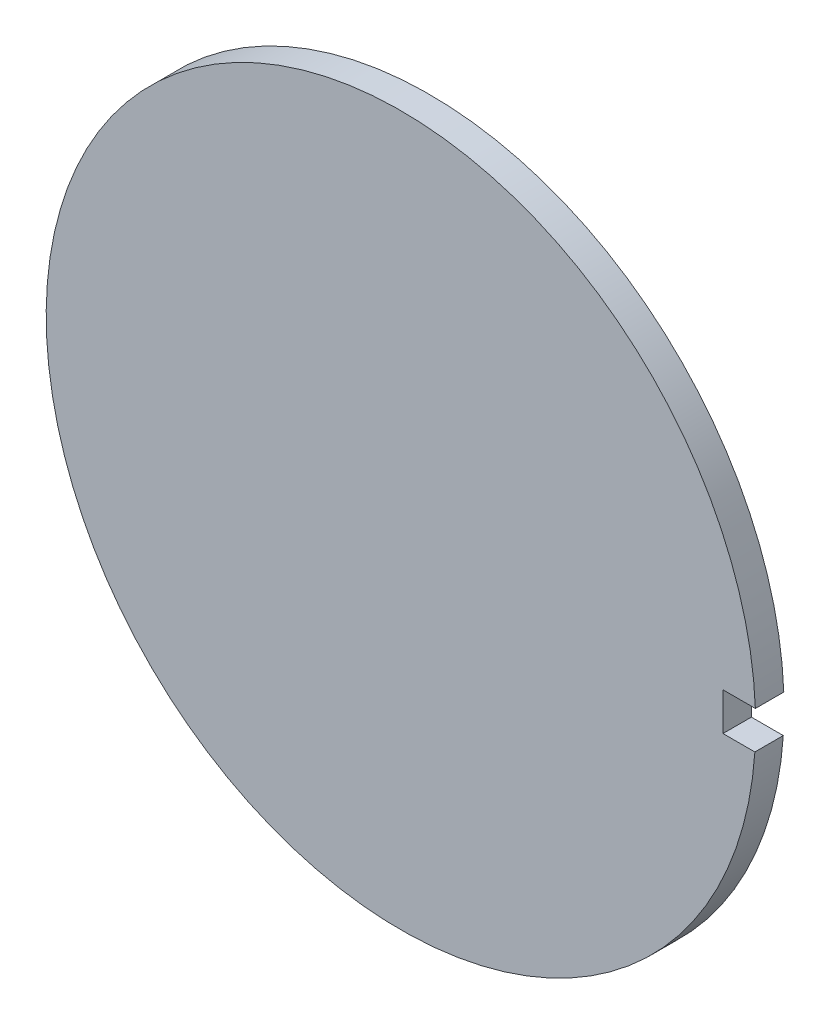
ISO-10303-21;
HEADER;
FILE_DESCRIPTION(('STEP AP214'),'2;1');
FILE_NAME('part.step','',(''),(''),'','','');
FILE_SCHEMA(('AUTOMOTIVE_DESIGN { 1 0 10303 214 1 1 1 1 }'));
ENDSEC;
DATA;
#1=APPLICATION_CONTEXT('core data for automotive mechanical design processes');
#2=APPLICATION_PROTOCOL_DEFINITION('international standard','automotive_design',2000,#1);
#3=PRODUCT_CONTEXT('',#1,'mechanical');
#4=PRODUCT('Part','Part','',(#3));
#5=PRODUCT_RELATED_PRODUCT_CATEGORY('part','',(#4));
#6=PRODUCT_DEFINITION_FORMATION('','',#4);
#7=PRODUCT_DEFINITION_CONTEXT('part definition',#1,'design');
#8=PRODUCT_DEFINITION('design','',#6,#7);
#9=PRODUCT_DEFINITION_SHAPE('','',#8);
#10=(LENGTH_UNIT() NAMED_UNIT(*) SI_UNIT(.MILLI.,.METRE.));
#11=(NAMED_UNIT(*) PLANE_ANGLE_UNIT() SI_UNIT($,.RADIAN.));
#12=(NAMED_UNIT(*) SI_UNIT($,.STERADIAN.) SOLID_ANGLE_UNIT());
#13=UNCERTAINTY_MEASURE_WITH_UNIT(LENGTH_MEASURE(1.E-05),#10,'distance_accuracy_value','');
#14=(GEOMETRIC_REPRESENTATION_CONTEXT(3) GLOBAL_UNCERTAINTY_ASSIGNED_CONTEXT((#13)) GLOBAL_UNIT_ASSIGNED_CONTEXT((#10,
#11,#12)) REPRESENTATION_CONTEXT('',''));
#15=CARTESIAN_POINT('',(0.,0.,0.));
#16=DIRECTION('',(0.,0.,1.));
#17=DIRECTION('',(1.,0.,0.));
#18=AXIS2_PLACEMENT_3D('',#15,#16,#17);
#19=CARTESIAN_POINT('',(0.,0.,-6.2));
#20=DIRECTION('',(0.,0.,1.));
#21=DIRECTION('',(1.,0.,0.));
#22=AXIS2_PLACEMENT_3D('',#19,#20,#21);
#23=CYLINDRICAL_SURFACE('',#22,18.725);
#24=CARTESIAN_POINT('',(0.,0.,0.));
#25=DIRECTION('',(0.,0.,-1.));
#26=DIRECTION('',(-1.,0.,0.));
#27=AXIS2_PLACEMENT_3D('',#24,#25,#26);
#28=CIRCLE('',#27,18.725);
#29=CARTESIAN_POINT('',(18.6833299688909,-1.24852163519195,0.));
#30=VERTEX_POINT('',#29);
#31=CARTESIAN_POINT('',(18.7099146247979,0.751478364808046,0.));
#32=VERTEX_POINT('',#31);
#33=EDGE_CURVE('E54',#30,#32,#28,.T.);
#34=ORIENTED_EDGE('',*,*,#33,.T.);
#35=DIRECTION('',(0.,0.,1.));
#36=VECTOR('',#35,1.);
#37=CARTESIAN_POINT('',(18.7099146247979,0.751478364808046,-6.2));
#38=LINE('',#37,#36);
#39=CARTESIAN_POINT('',(18.7099146247979,0.751478364808046,-1.5));
#40=VERTEX_POINT('',#39);
#41=EDGE_CURVE('E68',#32,#40,#38,.F.);
#42=ORIENTED_EDGE('',*,*,#41,.T.);
#43=CARTESIAN_POINT('',(0.,0.,-1.5));
#44=DIRECTION('',(0.,0.,-1.));
#45=DIRECTION('',(-1.,0.,0.));
#46=AXIS2_PLACEMENT_3D('',#43,#44,#45);
#47=CIRCLE('',#46,18.725);
#48=CARTESIAN_POINT('',(18.6833299688909,-1.24852163519195,-1.5));
#49=VERTEX_POINT('',#48);
#50=EDGE_CURVE('E115',#49,#40,#47,.T.);
#51=ORIENTED_EDGE('',*,*,#50,.F.);
#52=DIRECTION('',(0.,0.,1.));
#53=VECTOR('',#52,1.);
#54=CARTESIAN_POINT('',(18.6833299688909,-1.24852163519195,-6.2));
#55=LINE('',#54,#53);
#56=EDGE_CURVE('E60',#49,#30,#55,.T.);
#57=ORIENTED_EDGE('',*,*,#56,.T.);
#58=EDGE_LOOP('',(#34,#42,#51,#57));
#59=FACE_BOUND('',#58,.T.);
#60=ADVANCED_FACE('F47',(#59),#23,.T.);
#61=CARTESIAN_POINT('',(0.,0.,0.));
#62=DIRECTION('',(0.,0.,-1.));
#63=DIRECTION('',(-1.,0.,0.));
#64=AXIS2_PLACEMENT_3D('',#61,#62,#63);
#65=PLANE('',#64);
#66=DIRECTION('',(0.,1.,0.));
#67=VECTOR('',#66,1.);
#68=CARTESIAN_POINT('',(17.,0.,0.));
#69=LINE('',#68,#67);
#70=CARTESIAN_POINT('',(17.,-1.24852163519195,0.));
#71=VERTEX_POINT('',#70);
#72=CARTESIAN_POINT('',(17.,0.751478364808046,0.));
#73=VERTEX_POINT('',#72);
#74=EDGE_CURVE('E94',#71,#73,#69,.T.);
#75=ORIENTED_EDGE('',*,*,#74,.T.);
#76=DIRECTION('',(1.,0.,0.));
#77=VECTOR('',#76,1.);
#78=CARTESIAN_POINT('',(0.,0.751478364808045,0.));
#79=LINE('',#78,#77);
#80=EDGE_CURVE('E112',#73,#32,#79,.T.);
#81=ORIENTED_EDGE('',*,*,#80,.T.);
#82=ORIENTED_EDGE('',*,*,#33,.F.);
#83=DIRECTION('',(-1.,0.,0.));
#84=VECTOR('',#83,1.);
#85=CARTESIAN_POINT('',(0.,-1.24852163519195,0.));
#86=LINE('',#85,#84);
#87=EDGE_CURVE('E107',#30,#71,#86,.T.);
#88=ORIENTED_EDGE('',*,*,#87,.T.);
#89=EDGE_LOOP('',(#75,#81,#82,#88));
#90=FACE_BOUND('',#89,.T.);
#91=ADVANCED_FACE('F120',(#90),#65,.F.);
#92=CARTESIAN_POINT('',(0.,0.,-1.5));
#93=DIRECTION('',(0.,0.,-1.));
#94=DIRECTION('',(-1.,0.,0.));
#95=AXIS2_PLACEMENT_3D('',#92,#93,#94);
#96=PLANE('',#95);
#97=DIRECTION('',(1.,0.,0.));
#98=VECTOR('',#97,1.);
#99=CARTESIAN_POINT('',(21.6470470626813,0.751478364808046,-1.5));
#100=LINE('',#99,#98);
#101=CARTESIAN_POINT('',(17.,0.751478364808046,-1.5));
#102=VERTEX_POINT('',#101);
#103=EDGE_CURVE('E97',#102,#40,#100,.T.);
#104=ORIENTED_EDGE('',*,*,#103,.F.);
#105=DIRECTION('',(0.,1.,0.));
#106=VECTOR('',#105,1.);
#107=CARTESIAN_POINT('',(17.,0.751478364808046,-1.5));
#108=LINE('',#107,#106);
#109=CARTESIAN_POINT('',(17.,-1.24852163519195,-1.5));
#110=VERTEX_POINT('',#109);
#111=EDGE_CURVE('E91',#110,#102,#108,.T.);
#112=ORIENTED_EDGE('',*,*,#111,.F.);
#113=DIRECTION('',(-1.,0.,0.));
#114=VECTOR('',#113,1.);
#115=CARTESIAN_POINT('',(0.,-1.24852163519195,-1.5));
#116=LINE('',#115,#114);
#117=EDGE_CURVE('E12',#49,#110,#116,.T.);
#118=ORIENTED_EDGE('',*,*,#117,.F.);
#119=ORIENTED_EDGE('',*,*,#50,.T.);
#120=EDGE_LOOP('',(#104,#112,#118,#119));
#121=FACE_BOUND('',#120,.T.);
#122=ADVANCED_FACE('F103',(#121),#96,.T.);
#123=CARTESIAN_POINT('',(21.6470470626813,0.751478364808046,8.5));
#124=DIRECTION('',(0.,1.,0.));
#125=DIRECTION('',(-1.,0.,0.));
#126=AXIS2_PLACEMENT_3D('',#123,#124,#125);
#127=PLANE('',#126);
#128=ORIENTED_EDGE('',*,*,#80,.F.);
#129=DIRECTION('',(0.,0.,-1.));
#130=VECTOR('',#129,1.);
#131=CARTESIAN_POINT('',(17.,0.751478364808046,8.5));
#132=LINE('',#131,#130);
#133=EDGE_CURVE('E96',#73,#102,#132,.T.);
#134=ORIENTED_EDGE('',*,*,#133,.T.);
#135=ORIENTED_EDGE('',*,*,#103,.T.);
#136=ORIENTED_EDGE('',*,*,#41,.F.);
#137=EDGE_LOOP('',(#128,#134,#135,#136));
#138=FACE_BOUND('',#137,.T.);
#139=ADVANCED_FACE('F121',(#138),#127,.F.);
#140=CARTESIAN_POINT('',(17.,0.751478364808046,8.5));
#141=DIRECTION('',(-1.,0.,0.));
#142=DIRECTION('',(0.,0.,1.));
#143=AXIS2_PLACEMENT_3D('',#140,#141,#142);
#144=PLANE('',#143);
#145=DIRECTION('',(0.,0.,-1.));
#146=VECTOR('',#145,1.);
#147=CARTESIAN_POINT('',(17.,-1.24852163519195,8.5));
#148=LINE('',#147,#146);
#149=EDGE_CURVE('E87',#71,#110,#148,.T.);
#150=ORIENTED_EDGE('',*,*,#149,.T.);
#151=ORIENTED_EDGE('',*,*,#111,.T.);
#152=ORIENTED_EDGE('',*,*,#133,.F.);
#153=ORIENTED_EDGE('',*,*,#74,.F.);
#154=EDGE_LOOP('',(#150,#151,#152,#153));
#155=FACE_BOUND('',#154,.T.);
#156=ADVANCED_FACE('F88',(#155),#144,.F.);
#157=CARTESIAN_POINT('',(21.6470470626813,-1.24852163519195,8.5));
#158=DIRECTION('',(0.,-1.,0.));
#159=DIRECTION('',(0.,0.,-1.));
#160=AXIS2_PLACEMENT_3D('',#157,#158,#159);
#161=PLANE('',#160);
#162=ORIENTED_EDGE('',*,*,#117,.T.);
#163=ORIENTED_EDGE('',*,*,#149,.F.);
#164=ORIENTED_EDGE('',*,*,#87,.F.);
#165=ORIENTED_EDGE('',*,*,#56,.F.);
#166=EDGE_LOOP('',(#162,#163,#164,#165));
#167=FACE_BOUND('',#166,.T.);
#168=ADVANCED_FACE('F99',(#167),#161,.F.);
#169=CLOSED_SHELL('',(#60,#91,#122,#139,#156,#168));
#170=MANIFOLD_SOLID_BREP('B2',#169);
#171=ADVANCED_BREP_SHAPE_REPRESENTATION('',(#18,#170),#14);
#172=SHAPE_DEFINITION_REPRESENTATION(#9,#171);
ENDSEC;
END-ISO-10303-21;
